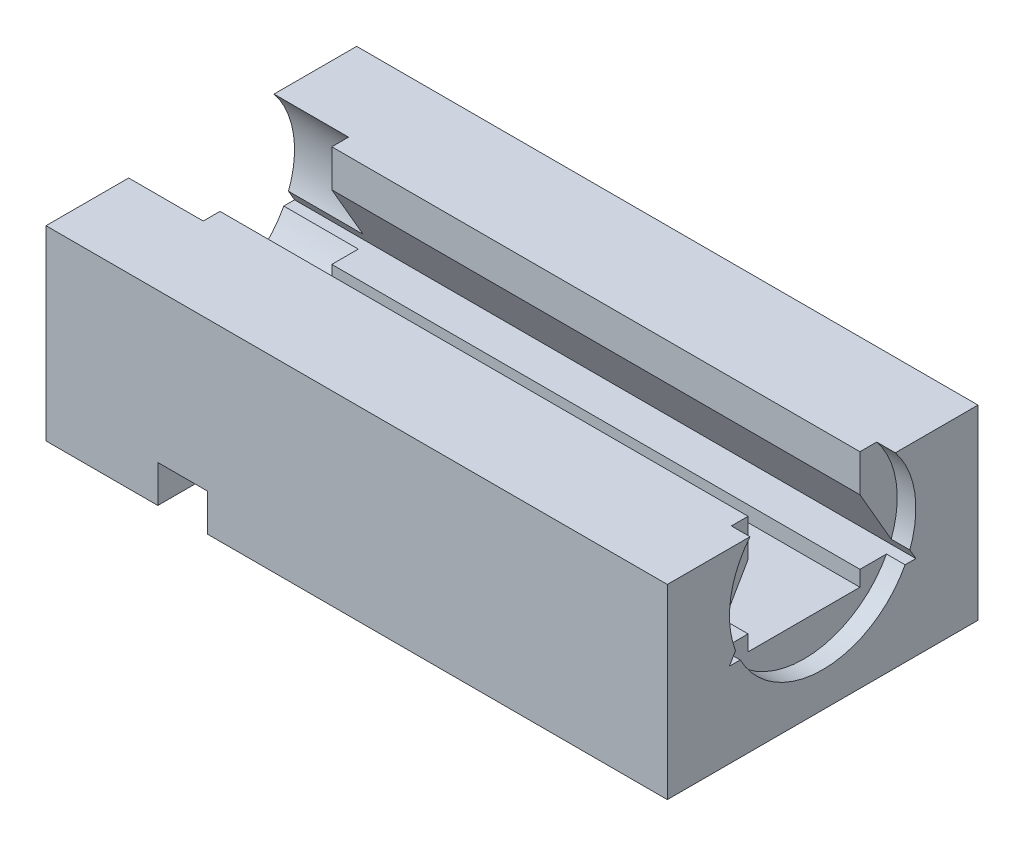
ISO-10303-21;
HEADER;
FILE_DESCRIPTION(('STEP AP214'),'2;1');
FILE_NAME('part.step','',(''),(''),'','','');
FILE_SCHEMA(('AUTOMOTIVE_DESIGN { 1 0 10303 214 1 1 1 1 }'));
ENDSEC;
DATA;
#1=APPLICATION_CONTEXT('core data for automotive mechanical design processes');
#2=APPLICATION_PROTOCOL_DEFINITION('international standard','automotive_design',2000,#1);
#3=PRODUCT_CONTEXT('',#1,'mechanical');
#4=PRODUCT('Part','Part','',(#3));
#5=PRODUCT_RELATED_PRODUCT_CATEGORY('part','',(#4));
#6=PRODUCT_DEFINITION_FORMATION('','',#4);
#7=PRODUCT_DEFINITION_CONTEXT('part definition',#1,'design');
#8=PRODUCT_DEFINITION('design','',#6,#7);
#9=PRODUCT_DEFINITION_SHAPE('','',#8);
#10=(LENGTH_UNIT() NAMED_UNIT(*) SI_UNIT(.MILLI.,.METRE.));
#11=(NAMED_UNIT(*) PLANE_ANGLE_UNIT() SI_UNIT($,.RADIAN.));
#12=(NAMED_UNIT(*) SI_UNIT($,.STERADIAN.) SOLID_ANGLE_UNIT());
#13=UNCERTAINTY_MEASURE_WITH_UNIT(LENGTH_MEASURE(1.E-05),#10,'distance_accuracy_value','');
#14=(GEOMETRIC_REPRESENTATION_CONTEXT(3) GLOBAL_UNCERTAINTY_ASSIGNED_CONTEXT((#13)) GLOBAL_UNIT_ASSIGNED_CONTEXT((#10,
#11,#12)) REPRESENTATION_CONTEXT('',''));
#15=CARTESIAN_POINT('',(0.,0.,0.));
#16=DIRECTION('',(0.,0.,1.));
#17=DIRECTION('',(1.,0.,0.));
#18=AXIS2_PLACEMENT_3D('',#15,#16,#17);
#19=CARTESIAN_POINT('',(0.,1.,0.));
#20=DIRECTION('',(0.,1.,0.));
#21=DIRECTION('',(0.,0.,1.));
#22=AXIS2_PLACEMENT_3D('',#19,#20,#21);
#23=PLANE('',#22);
#24=DIRECTION('',(1.,0.,0.));
#25=VECTOR('',#24,1.);
#26=CARTESIAN_POINT('',(0.,1.,5.));
#27=LINE('',#26,#25);
#28=CARTESIAN_POINT('',(2.6,1.,5.));
#29=VERTEX_POINT('',#28);
#30=CARTESIAN_POINT('',(10.,1.,5.));
#31=VERTEX_POINT('',#30);
#32=EDGE_CURVE('E411',#29,#31,#27,.T.);
#33=ORIENTED_EDGE('',*,*,#32,.F.);
#34=DIRECTION('',(0.,0.,1.));
#35=VECTOR('',#34,1.);
#36=CARTESIAN_POINT('',(2.6,1.,0.));
#37=LINE('',#36,#35);
#38=CARTESIAN_POINT('',(2.6,1.,0.));
#39=VERTEX_POINT('',#38);
#40=EDGE_CURVE('E261',#39,#29,#37,.T.);
#41=ORIENTED_EDGE('',*,*,#40,.F.);
#42=DIRECTION('',(-1.,0.,0.));
#43=VECTOR('',#42,1.);
#44=CARTESIAN_POINT('',(10.,1.,0.));
#45=LINE('',#44,#43);
#46=CARTESIAN_POINT('',(10.,1.,0.));
#47=VERTEX_POINT('',#46);
#48=EDGE_CURVE('E405',#47,#39,#45,.T.);
#49=ORIENTED_EDGE('',*,*,#48,.F.);
#50=DIRECTION('',(0.,0.,-1.));
#51=VECTOR('',#50,1.);
#52=CARTESIAN_POINT('',(10.,1.,5.));
#53=LINE('',#52,#51);
#54=EDGE_CURVE('E415',#31,#47,#53,.T.);
#55=ORIENTED_EDGE('',*,*,#54,.F.);
#56=EDGE_LOOP('',(#33,#41,#49,#55));
#57=FACE_BOUND('',#56,.T.);
#58=ADVANCED_FACE('F35',(#57),#23,.F.);
#59=CARTESIAN_POINT('',(0.,0.,1.6));
#60=DIRECTION('',(0.,0.,-1.));
#61=DIRECTION('',(-1.,0.,0.));
#62=AXIS2_PLACEMENT_3D('',#59,#60,#61);
#63=PLANE('',#62);
#64=DIRECTION('',(0.,-1.,0.));
#65=VECTOR('',#64,1.);
#66=CARTESIAN_POINT('',(9.7,0.,1.6));
#67=LINE('',#66,#65);
#68=CARTESIAN_POINT('',(9.7,2.36076951545868,1.6));
#69=VERTEX_POINT('',#68);
#70=CARTESIAN_POINT('',(9.7,2.11076951545868,1.6));
#71=VERTEX_POINT('',#70);
#72=EDGE_CURVE('E271',#69,#71,#67,.T.);
#73=ORIENTED_EDGE('',*,*,#72,.F.);
#74=DIRECTION('',(1.,0.,0.));
#75=VECTOR('',#74,1.);
#76=CARTESIAN_POINT('',(0.,2.36076951545868,1.6));
#77=LINE('',#76,#75);
#78=CARTESIAN_POINT('',(1.2,2.36076951545868,1.6));
#79=VERTEX_POINT('',#78);
#80=EDGE_CURVE('E366',#79,#69,#77,.T.);
#81=ORIENTED_EDGE('',*,*,#80,.F.);
#82=DIRECTION('',(0.,1.,0.));
#83=VECTOR('',#82,1.);
#84=CARTESIAN_POINT('',(1.2,0.,1.6));
#85=LINE('',#84,#83);
#86=CARTESIAN_POINT('',(1.2,2.11076951545868,1.6));
#87=VERTEX_POINT('',#86);
#88=EDGE_CURVE('E317',#87,#79,#85,.T.);
#89=ORIENTED_EDGE('',*,*,#88,.F.);
#90=DIRECTION('',(1.,0.,0.));
#91=VECTOR('',#90,1.);
#92=CARTESIAN_POINT('',(0.,2.11076951545868,1.6));
#93=LINE('',#92,#91);
#94=EDGE_CURVE('E375',#87,#71,#93,.T.);
#95=ORIENTED_EDGE('',*,*,#94,.T.);
#96=EDGE_LOOP('',(#73,#81,#89,#95));
#97=FACE_BOUND('',#96,.T.);
#98=ADVANCED_FACE('F455',(#97),#63,.F.);
#99=CARTESIAN_POINT('',(0.,2.11076951545868,0.));
#100=DIRECTION('',(0.,-1.,0.));
#101=DIRECTION('',(0.,0.,-1.));
#102=AXIS2_PLACEMENT_3D('',#99,#100,#101);
#103=PLANE('',#102);
#104=DIRECTION('',(0.,0.,1.));
#105=VECTOR('',#104,1.);
#106=CARTESIAN_POINT('',(9.7,2.11076951545868,0.));
#107=LINE('',#106,#105);
#108=CARTESIAN_POINT('',(9.7,2.11076951545868,3.4));
#109=VERTEX_POINT('',#108);
#110=EDGE_CURVE('E273',#71,#109,#107,.T.);
#111=ORIENTED_EDGE('',*,*,#110,.F.);
#112=ORIENTED_EDGE('',*,*,#94,.F.);
#113=DIRECTION('',(0.,0.,-1.));
#114=VECTOR('',#113,1.);
#115=CARTESIAN_POINT('',(1.2,2.11076951545868,0.));
#116=LINE('',#115,#114);
#117=CARTESIAN_POINT('',(1.2,2.11076951545868,3.4));
#118=VERTEX_POINT('',#117);
#119=EDGE_CURVE('E319',#118,#87,#116,.T.);
#120=ORIENTED_EDGE('',*,*,#119,.F.);
#121=DIRECTION('',(1.,0.,0.));
#122=VECTOR('',#121,1.);
#123=CARTESIAN_POINT('',(0.,2.11076951545868,3.4));
#124=LINE('',#123,#122);
#125=EDGE_CURVE('E379',#118,#109,#124,.T.);
#126=ORIENTED_EDGE('',*,*,#125,.T.);
#127=EDGE_LOOP('',(#111,#112,#120,#126));
#128=FACE_BOUND('',#127,.T.);
#129=ADVANCED_FACE('F560',(#128),#103,.F.);
#130=CARTESIAN_POINT('',(0.,0.,3.4));
#131=DIRECTION('',(0.,0.,1.));
#132=DIRECTION('',(1.,0.,0.));
#133=AXIS2_PLACEMENT_3D('',#130,#131,#132);
#134=PLANE('',#133);
#135=DIRECTION('',(0.,1.,0.));
#136=VECTOR('',#135,1.);
#137=CARTESIAN_POINT('',(9.7,0.,3.4));
#138=LINE('',#137,#136);
#139=CARTESIAN_POINT('',(9.7,2.36076951545868,3.4));
#140=VERTEX_POINT('',#139);
#141=EDGE_CURVE('E275',#109,#140,#138,.T.);
#142=ORIENTED_EDGE('',*,*,#141,.F.);
#143=ORIENTED_EDGE('',*,*,#125,.F.);
#144=DIRECTION('',(0.,-1.,0.));
#145=VECTOR('',#144,1.);
#146=CARTESIAN_POINT('',(1.2,0.,3.4));
#147=LINE('',#146,#145);
#148=CARTESIAN_POINT('',(1.2,2.36076951545868,3.4));
#149=VERTEX_POINT('',#148);
#150=EDGE_CURVE('E321',#149,#118,#147,.T.);
#151=ORIENTED_EDGE('',*,*,#150,.F.);
#152=DIRECTION('',(1.,0.,0.));
#153=VECTOR('',#152,1.);
#154=CARTESIAN_POINT('',(0.,2.36076951545868,3.4));
#155=LINE('',#154,#153);
#156=EDGE_CURVE('E382',#149,#140,#155,.T.);
#157=ORIENTED_EDGE('',*,*,#156,.T.);
#158=EDGE_LOOP('',(#142,#143,#151,#157));
#159=FACE_BOUND('',#158,.T.);
#160=ADVANCED_FACE('F693',(#159),#134,.F.);
#161=CARTESIAN_POINT('',(0.,0.,3.4));
#162=DIRECTION('',(0.,0.,-1.));
#163=DIRECTION('',(-1.,0.,0.));
#164=AXIS2_PLACEMENT_3D('',#161,#162,#163);
#165=PLANE('',#164);
#166=DIRECTION('',(1.,0.,0.));
#167=VECTOR('',#166,1.);
#168=CARTESIAN_POINT('',(0.,4.,3.4));
#169=LINE('',#168,#167);
#170=CARTESIAN_POINT('',(1.2,4.,3.4));
#171=VERTEX_POINT('',#170);
#172=CARTESIAN_POINT('',(9.7,4.,3.4));
#173=VERTEX_POINT('',#172);
#174=EDGE_CURVE('E391',#171,#173,#169,.T.);
#175=ORIENTED_EDGE('',*,*,#174,.T.);
#176=DIRECTION('',(0.,-1.,0.));
#177=VECTOR('',#176,1.);
#178=CARTESIAN_POINT('',(9.7,0.,3.4));
#179=LINE('',#178,#177);
#180=CARTESIAN_POINT('',(9.7,3.4,3.4));
#181=VERTEX_POINT('',#180);
#182=EDGE_CURVE('E289',#173,#181,#179,.T.);
#183=ORIENTED_EDGE('',*,*,#182,.T.);
#184=DIRECTION('',(1.,0.,0.));
#185=VECTOR('',#184,1.);
#186=CARTESIAN_POINT('',(0.,3.4,3.4));
#187=LINE('',#186,#185);
#188=CARTESIAN_POINT('',(1.2,3.4,3.4));
#189=VERTEX_POINT('',#188);
#190=EDGE_CURVE('E388',#189,#181,#187,.T.);
#191=ORIENTED_EDGE('',*,*,#190,.F.);
#192=DIRECTION('',(0.,1.,0.));
#193=VECTOR('',#192,1.);
#194=CARTESIAN_POINT('',(1.2,0.,3.4));
#195=LINE('',#194,#193);
#196=EDGE_CURVE('E333',#189,#171,#195,.T.);
#197=ORIENTED_EDGE('',*,*,#196,.T.);
#198=EDGE_LOOP('',(#175,#183,#191,#197));
#199=FACE_BOUND('',#198,.T.);
#200=ADVANCED_FACE('F521',(#199),#165,.T.);
#201=CARTESIAN_POINT('',(0.,0.,1.6));
#202=DIRECTION('',(0.,0.,1.));
#203=DIRECTION('',(1.,0.,0.));
#204=AXIS2_PLACEMENT_3D('',#201,#202,#203);
#205=PLANE('',#204);
#206=DIRECTION('',(1.,0.,0.));
#207=VECTOR('',#206,1.);
#208=CARTESIAN_POINT('',(0.,3.4,1.6));
#209=LINE('',#208,#207);
#210=CARTESIAN_POINT('',(1.2,3.4,1.6));
#211=VERTEX_POINT('',#210);
#212=CARTESIAN_POINT('',(9.7,3.4,1.6));
#213=VERTEX_POINT('',#212);
#214=EDGE_CURVE('E397',#211,#213,#209,.T.);
#215=ORIENTED_EDGE('',*,*,#214,.T.);
#216=DIRECTION('',(0.,1.,0.));
#217=VECTOR('',#216,1.);
#218=CARTESIAN_POINT('',(9.7,0.,1.6));
#219=LINE('',#218,#217);
#220=CARTESIAN_POINT('',(9.7,4.,1.6));
#221=VERTEX_POINT('',#220);
#222=EDGE_CURVE('E281',#213,#221,#219,.T.);
#223=ORIENTED_EDGE('',*,*,#222,.T.);
#224=DIRECTION('',(1.,0.,0.));
#225=VECTOR('',#224,1.);
#226=CARTESIAN_POINT('',(0.,4.,1.6));
#227=LINE('',#226,#225);
#228=CARTESIAN_POINT('',(1.2,4.,1.6));
#229=VERTEX_POINT('',#228);
#230=EDGE_CURVE('E394',#229,#221,#227,.T.);
#231=ORIENTED_EDGE('',*,*,#230,.F.);
#232=DIRECTION('',(0.,-1.,0.));
#233=VECTOR('',#232,1.);
#234=CARTESIAN_POINT('',(1.2,0.,1.6));
#235=LINE('',#234,#233);
#236=EDGE_CURVE('E327',#229,#211,#235,.T.);
#237=ORIENTED_EDGE('',*,*,#236,.T.);
#238=EDGE_LOOP('',(#215,#223,#231,#237));
#239=FACE_BOUND('',#238,.T.);
#240=ADVANCED_FACE('F484',(#239),#205,.T.);
#241=CARTESIAN_POINT('',(10.,1.,5.));
#242=DIRECTION('',(1.,0.,0.));
#243=DIRECTION('',(0.,0.,-1.));
#244=AXIS2_PLACEMENT_3D('',#241,#242,#243);
#245=PLANE('',#244);
#246=CARTESIAN_POINT('',(10.,3.06076951545868,2.5));
#247=DIRECTION('',(1.,0.,0.));
#248=DIRECTION('',(0.,0.,-1.));
#249=AXIS2_PLACEMENT_3D('',#246,#247,#248);
#250=CIRCLE('',#249,1.5);
#251=CARTESIAN_POINT('',(10.,4.,3.66954952734302));
#252=VERTEX_POINT('',#251);
#253=CARTESIAN_POINT('',(10.,2.52930894351317,3.90269371584368));
#254=VERTEX_POINT('',#253);
#255=EDGE_CURVE('E268',#252,#254,#250,.T.);
#256=ORIENTED_EDGE('',*,*,#255,.F.);
#257=DIRECTION('',(0.,0.,-1.));
#258=VECTOR('',#257,1.);
#259=CARTESIAN_POINT('',(10.,4.,5.));
#260=LINE('',#259,#258);
#261=CARTESIAN_POINT('',(10.,4.,5.));
#262=VERTEX_POINT('',#261);
#263=EDGE_CURVE('E429',#262,#252,#260,.T.);
#264=ORIENTED_EDGE('',*,*,#263,.F.);
#265=DIRECTION('',(0.,1.,0.));
#266=VECTOR('',#265,1.);
#267=CARTESIAN_POINT('',(10.,1.,5.));
#268=LINE('',#267,#266);
#269=EDGE_CURVE('E436',#31,#262,#268,.T.);
#270=ORIENTED_EDGE('',*,*,#269,.F.);
#271=ORIENTED_EDGE('',*,*,#54,.T.);
#272=DIRECTION('',(0.,1.,0.));
#273=VECTOR('',#272,1.);
#274=CARTESIAN_POINT('',(10.,1.,0.));
#275=LINE('',#274,#273);
#276=CARTESIAN_POINT('',(10.,4.,0.));
#277=VERTEX_POINT('',#276);
#278=EDGE_CURVE('E432',#47,#277,#275,.T.);
#279=ORIENTED_EDGE('',*,*,#278,.T.);
#280=CARTESIAN_POINT('',(10.,4.,1.33045047265698));
#281=VERTEX_POINT('',#280);
#282=EDGE_CURVE('E428',#281,#277,#260,.T.);
#283=ORIENTED_EDGE('',*,*,#282,.F.);
#284=CARTESIAN_POINT('',(10.,2.52930894351317,1.09730628415632));
#285=VERTEX_POINT('',#284);
#286=EDGE_CURVE('E260',#285,#281,#250,.T.);
#287=ORIENTED_EDGE('',*,*,#286,.F.);
#288=DIRECTION('',(0.,0.866025403784436,0.500000000000004));
#289=VECTOR('',#288,1.);
#290=CARTESIAN_POINT('',(10.,0.157179676972459,-0.27224318643356));
#291=LINE('',#290,#289);
#292=CARTESIAN_POINT('',(10.,2.36076951545868,0.999999999999999));
#293=VERTEX_POINT('',#292);
#294=EDGE_CURVE('E368',#293,#285,#291,.T.);
#295=ORIENTED_EDGE('',*,*,#294,.F.);
#296=DIRECTION('',(0.,0.,-1.));
#297=VECTOR('',#296,1.);
#298=CARTESIAN_POINT('',(10.,2.36076951545868,0.));
#299=LINE('',#298,#297);
#300=CARTESIAN_POINT('',(10.,2.36076951545868,1.17335008385784));
#301=VERTEX_POINT('',#300);
#302=EDGE_CURVE('E354',#301,#293,#299,.T.);
#303=ORIENTED_EDGE('',*,*,#302,.F.);
#304=CARTESIAN_POINT('',(10.,2.36076951545868,3.82664991614216));
#305=VERTEX_POINT('',#304);
#306=EDGE_CURVE('E270',#305,#301,#250,.T.);
#307=ORIENTED_EDGE('',*,*,#306,.F.);
#308=DIRECTION('',(0.,0.,-1.));
#309=VECTOR('',#308,1.);
#310=CARTESIAN_POINT('',(10.,2.36076951545868,0.));
#311=LINE('',#310,#309);
#312=CARTESIAN_POINT('',(10.,2.36076951545868,4.));
#313=VERTEX_POINT('',#312);
#314=EDGE_CURVE('E358',#313,#305,#311,.T.);
#315=ORIENTED_EDGE('',*,*,#314,.F.);
#316=DIRECTION('',(0.,-0.866025403784437,0.500000000000004));
#317=VECTOR('',#316,1.);
#318=CARTESIAN_POINT('',(10.,2.32224318643356,4.02224318643354));
#319=LINE('',#318,#317);
#320=EDGE_CURVE('E371',#254,#313,#319,.T.);
#321=ORIENTED_EDGE('',*,*,#320,.F.);
#322=EDGE_LOOP('',(#256,#264,#270,#271,#279,#283,#287,#295,#303,#307,#315,#321));
#323=FACE_BOUND('',#322,.T.);
#324=ADVANCED_FACE('F509',(#323),#245,.T.);
#325=CARTESIAN_POINT('',(0.,1.,0.));
#326=DIRECTION('',(-1.,0.,0.));
#327=DIRECTION('',(0.,0.,1.));
#328=AXIS2_PLACEMENT_3D('',#325,#326,#327);
#329=PLANE('',#328);
#330=CARTESIAN_POINT('',(0.,3.06076951545868,2.5));
#331=DIRECTION('',(-1.,0.,0.));
#332=DIRECTION('',(0.,0.,1.));
#333=AXIS2_PLACEMENT_3D('',#330,#331,#332);
#334=CIRCLE('',#333,1.5);
#335=CARTESIAN_POINT('',(0.,4.,1.33045047265698));
#336=VERTEX_POINT('',#335);
#337=CARTESIAN_POINT('',(0.,2.52930894351317,1.09730628415632));
#338=VERTEX_POINT('',#337);
#339=EDGE_CURVE('E313',#336,#338,#334,.T.);
#340=ORIENTED_EDGE('',*,*,#339,.F.);
#341=DIRECTION('',(0.,0.,1.));
#342=VECTOR('',#341,1.);
#343=CARTESIAN_POINT('',(0.,4.,0.));
#344=LINE('',#343,#342);
#345=CARTESIAN_POINT('',(0.,4.,0.));
#346=VERTEX_POINT('',#345);
#347=EDGE_CURVE('E422',#346,#336,#344,.T.);
#348=ORIENTED_EDGE('',*,*,#347,.F.);
#349=DIRECTION('',(0.,1.,0.));
#350=VECTOR('',#349,1.);
#351=CARTESIAN_POINT('',(0.,1.,0.));
#352=LINE('',#351,#350);
#353=CARTESIAN_POINT('',(0.,1.,0.));
#354=VERTEX_POINT('',#353);
#355=EDGE_CURVE('E418',#354,#346,#352,.T.);
#356=ORIENTED_EDGE('',*,*,#355,.F.);
#357=DIRECTION('',(0.,0.,1.));
#358=VECTOR('',#357,1.);
#359=CARTESIAN_POINT('',(0.,1.,0.));
#360=LINE('',#359,#358);
#361=CARTESIAN_POINT('',(0.,1.,5.));
#362=VERTEX_POINT('',#361);
#363=EDGE_CURVE('E407',#354,#362,#360,.T.);
#364=ORIENTED_EDGE('',*,*,#363,.T.);
#365=DIRECTION('',(0.,1.,0.));
#366=VECTOR('',#365,1.);
#367=CARTESIAN_POINT('',(0.,1.,5.));
#368=LINE('',#367,#366);
#369=CARTESIAN_POINT('',(0.,4.,5.));
#370=VERTEX_POINT('',#369);
#371=EDGE_CURVE('E438',#362,#370,#368,.T.);
#372=ORIENTED_EDGE('',*,*,#371,.T.);
#373=CARTESIAN_POINT('',(0.,4.,3.66954952734302));
#374=VERTEX_POINT('',#373);
#375=EDGE_CURVE('E421',#374,#370,#344,.T.);
#376=ORIENTED_EDGE('',*,*,#375,.F.);
#377=CARTESIAN_POINT('',(0.,2.52930894351317,3.90269371584368));
#378=VERTEX_POINT('',#377);
#379=EDGE_CURVE('E308',#378,#374,#334,.T.);
#380=ORIENTED_EDGE('',*,*,#379,.F.);
#381=DIRECTION('',(0.,-0.866025403784437,0.500000000000004));
#382=VECTOR('',#381,1.);
#383=CARTESIAN_POINT('',(0.,2.32224318643356,4.02224318643354));
#384=LINE('',#383,#382);
#385=CARTESIAN_POINT('',(0.,2.36076951545868,4.));
#386=VERTEX_POINT('',#385);
#387=EDGE_CURVE('E361',#378,#386,#384,.T.);
#388=ORIENTED_EDGE('',*,*,#387,.T.);
#389=DIRECTION('',(0.,0.,-1.));
#390=VECTOR('',#389,1.);
#391=CARTESIAN_POINT('',(0.,2.36076951545868,0.));
#392=LINE('',#391,#390);
#393=CARTESIAN_POINT('',(0.,2.36076951545868,3.82664991614216));
#394=VERTEX_POINT('',#393);
#395=EDGE_CURVE('E363',#386,#394,#392,.T.);
#396=ORIENTED_EDGE('',*,*,#395,.T.);
#397=CARTESIAN_POINT('',(0.,2.36076951545868,1.17335008385784));
#398=VERTEX_POINT('',#397);
#399=EDGE_CURVE('E316',#398,#394,#334,.T.);
#400=ORIENTED_EDGE('',*,*,#399,.F.);
#401=DIRECTION('',(0.,0.,-1.));
#402=VECTOR('',#401,1.);
#403=CARTESIAN_POINT('',(0.,2.36076951545868,0.));
#404=LINE('',#403,#402);
#405=CARTESIAN_POINT('',(0.,2.36076951545868,0.999999999999999));
#406=VERTEX_POINT('',#405);
#407=EDGE_CURVE('E355',#398,#406,#404,.T.);
#408=ORIENTED_EDGE('',*,*,#407,.T.);
#409=DIRECTION('',(0.,0.866025403784436,0.500000000000004));
#410=VECTOR('',#409,1.);
#411=CARTESIAN_POINT('',(0.,0.157179676972459,-0.27224318643356));
#412=LINE('',#411,#410);
#413=EDGE_CURVE('E357',#406,#338,#412,.T.);
#414=ORIENTED_EDGE('',*,*,#413,.T.);
#415=EDGE_LOOP('',(#340,#348,#356,#364,#372,#376,#380,#388,#396,#400,#408,#414));
#416=FACE_BOUND('',#415,.T.);
#417=ADVANCED_FACE('F491',(#416),#329,.T.);
#418=CARTESIAN_POINT('',(0.,4.,0.));
#419=DIRECTION('',(0.,1.,0.));
#420=DIRECTION('',(0.,0.,1.));
#421=AXIS2_PLACEMENT_3D('',#418,#419,#420);
#422=PLANE('',#421);
#423=DIRECTION('',(1.,0.,0.));
#424=VECTOR('',#423,1.);
#425=CARTESIAN_POINT('',(9.7,4.,3.66954952734302));
#426=LINE('',#425,#424);
#427=CARTESIAN_POINT('',(9.7,4.,3.66954952734302));
#428=VERTEX_POINT('',#427);
#429=EDGE_CURVE('E306',#428,#252,#426,.T.);
#430=ORIENTED_EDGE('',*,*,#429,.F.);
#431=DIRECTION('',(0.,0.,-1.));
#432=VECTOR('',#431,1.);
#433=CARTESIAN_POINT('',(9.7,4.,0.));
#434=LINE('',#433,#432);
#435=EDGE_CURVE('E292',#428,#173,#434,.T.);
#436=ORIENTED_EDGE('',*,*,#435,.T.);
#437=ORIENTED_EDGE('',*,*,#174,.F.);
#438=DIRECTION('',(0.,0.,1.));
#439=VECTOR('',#438,1.);
#440=CARTESIAN_POINT('',(1.2,4.,0.));
#441=LINE('',#440,#439);
#442=CARTESIAN_POINT('',(1.2,4.,3.66954952734302));
#443=VERTEX_POINT('',#442);
#444=EDGE_CURVE('E338',#171,#443,#441,.T.);
#445=ORIENTED_EDGE('',*,*,#444,.T.);
#446=DIRECTION('',(-1.,0.,0.));
#447=VECTOR('',#446,1.);
#448=CARTESIAN_POINT('',(1.2,4.,3.66954952734302));
#449=LINE('',#448,#447);
#450=EDGE_CURVE('E352',#374,#443,#449,.F.);
#451=ORIENTED_EDGE('',*,*,#450,.F.);
#452=ORIENTED_EDGE('',*,*,#375,.T.);
#453=DIRECTION('',(1.,0.,0.));
#454=VECTOR('',#453,1.);
#455=CARTESIAN_POINT('',(0.,4.,5.));
#456=LINE('',#455,#454);
#457=EDGE_CURVE('E425',#370,#262,#456,.T.);
#458=ORIENTED_EDGE('',*,*,#457,.T.);
#459=ORIENTED_EDGE('',*,*,#263,.T.);
#460=EDGE_LOOP('',(#430,#436,#437,#445,#451,#452,#458,#459));
#461=FACE_BOUND('',#460,.T.);
#462=ADVANCED_FACE('F524',(#461),#422,.T.);
#463=DIRECTION('',(1.,0.,0.));
#464=VECTOR('',#463,1.);
#465=CARTESIAN_POINT('',(9.7,4.,1.33045047265698));
#466=LINE('',#465,#464);
#467=CARTESIAN_POINT('',(9.7,4.,1.33045047265698));
#468=VERTEX_POINT('',#467);
#469=EDGE_CURVE('E304',#281,#468,#466,.F.);
#470=ORIENTED_EDGE('',*,*,#469,.F.);
#471=ORIENTED_EDGE('',*,*,#282,.T.);
#472=DIRECTION('',(-1.,0.,0.));
#473=VECTOR('',#472,1.);
#474=CARTESIAN_POINT('',(10.,4.,0.));
#475=LINE('',#474,#473);
#476=EDGE_CURVE('E378',#277,#346,#475,.T.);
#477=ORIENTED_EDGE('',*,*,#476,.T.);
#478=ORIENTED_EDGE('',*,*,#347,.T.);
#479=DIRECTION('',(-1.,0.,0.));
#480=VECTOR('',#479,1.);
#481=CARTESIAN_POINT('',(1.2,4.,1.33045047265698));
#482=LINE('',#481,#480);
#483=CARTESIAN_POINT('',(1.2,4.,1.33045047265698));
#484=VERTEX_POINT('',#483);
#485=EDGE_CURVE('E350',#484,#336,#482,.T.);
#486=ORIENTED_EDGE('',*,*,#485,.F.);
#487=DIRECTION('',(0.,0.,1.));
#488=VECTOR('',#487,1.);
#489=CARTESIAN_POINT('',(1.2,4.,0.));
#490=LINE('',#489,#488);
#491=EDGE_CURVE('E330',#484,#229,#490,.T.);
#492=ORIENTED_EDGE('',*,*,#491,.T.);
#493=ORIENTED_EDGE('',*,*,#230,.T.);
#494=DIRECTION('',(0.,0.,-1.));
#495=VECTOR('',#494,1.);
#496=CARTESIAN_POINT('',(9.7,4.,0.));
#497=LINE('',#496,#495);
#498=EDGE_CURVE('E284',#221,#468,#497,.T.);
#499=ORIENTED_EDGE('',*,*,#498,.T.);
#500=EDGE_LOOP('',(#470,#471,#477,#478,#486,#492,#493,#499));
#501=FACE_BOUND('',#500,.T.);
#502=ADVANCED_FACE('F488',(#501),#422,.T.);
#503=CARTESIAN_POINT('',(10.,1.,0.));
#504=DIRECTION('',(0.,0.,-1.));
#505=DIRECTION('',(-1.,0.,0.));
#506=AXIS2_PLACEMENT_3D('',#503,#504,#505);
#507=PLANE('',#506);
#508=DIRECTION('',(0.,1.,0.));
#509=VECTOR('',#508,1.);
#510=CARTESIAN_POINT('',(2.6,1.6,0.));
#511=LINE('',#510,#509);
#512=CARTESIAN_POINT('',(2.6,1.6,0.));
#513=VERTEX_POINT('',#512);
#514=EDGE_CURVE('E241',#39,#513,#511,.T.);
#515=ORIENTED_EDGE('',*,*,#514,.T.);
#516=DIRECTION('',(-1.,0.,0.));
#517=VECTOR('',#516,1.);
#518=CARTESIAN_POINT('',(1.8,1.6,0.));
#519=LINE('',#518,#517);
#520=CARTESIAN_POINT('',(1.8,1.6,0.));
#521=VERTEX_POINT('',#520);
#522=EDGE_CURVE('E236',#513,#521,#519,.T.);
#523=ORIENTED_EDGE('',*,*,#522,.T.);
#524=DIRECTION('',(0.,-1.,0.));
#525=VECTOR('',#524,1.);
#526=CARTESIAN_POINT('',(1.8,1.,0.));
#527=LINE('',#526,#525);
#528=CARTESIAN_POINT('',(1.8,1.,0.));
#529=VERTEX_POINT('',#528);
#530=EDGE_CURVE('E244',#521,#529,#527,.T.);
#531=ORIENTED_EDGE('',*,*,#530,.T.);
#532=EDGE_CURVE('E408',#529,#354,#45,.T.);
#533=ORIENTED_EDGE('',*,*,#532,.T.);
#534=ORIENTED_EDGE('',*,*,#355,.T.);
#535=ORIENTED_EDGE('',*,*,#476,.F.);
#536=ORIENTED_EDGE('',*,*,#278,.F.);
#537=ORIENTED_EDGE('',*,*,#48,.T.);
#538=EDGE_LOOP('',(#515,#523,#531,#533,#534,#535,#536,#537));
#539=FACE_BOUND('',#538,.T.);
#540=ADVANCED_FACE('F37',(#539),#507,.T.);
#541=CARTESIAN_POINT('',(0.,1.,5.));
#542=DIRECTION('',(0.,0.,1.));
#543=DIRECTION('',(1.,0.,0.));
#544=AXIS2_PLACEMENT_3D('',#541,#542,#543);
#545=PLANE('',#544);
#546=DIRECTION('',(0.,1.,0.));
#547=VECTOR('',#546,1.);
#548=CARTESIAN_POINT('',(2.6,1.6,5.));
#549=LINE('',#548,#547);
#550=CARTESIAN_POINT('',(2.6,1.6,5.));
#551=VERTEX_POINT('',#550);
#552=EDGE_CURVE('E250',#29,#551,#549,.T.);
#553=ORIENTED_EDGE('',*,*,#552,.F.);
#554=ORIENTED_EDGE('',*,*,#32,.T.);
#555=ORIENTED_EDGE('',*,*,#269,.T.);
#556=ORIENTED_EDGE('',*,*,#457,.F.);
#557=ORIENTED_EDGE('',*,*,#371,.F.);
#558=CARTESIAN_POINT('',(1.8,1.,5.));
#559=VERTEX_POINT('',#558);
#560=EDGE_CURVE('E412',#362,#559,#27,.T.);
#561=ORIENTED_EDGE('',*,*,#560,.T.);
#562=DIRECTION('',(0.,-1.,0.));
#563=VECTOR('',#562,1.);
#564=CARTESIAN_POINT('',(1.8,1.,5.));
#565=LINE('',#564,#563);
#566=CARTESIAN_POINT('',(1.8,1.6,5.));
#567=VERTEX_POINT('',#566);
#568=EDGE_CURVE('E50',#567,#559,#565,.T.);
#569=ORIENTED_EDGE('',*,*,#568,.F.);
#570=DIRECTION('',(-1.,0.,0.));
#571=VECTOR('',#570,1.);
#572=CARTESIAN_POINT('',(1.8,1.6,5.));
#573=LINE('',#572,#571);
#574=EDGE_CURVE('E239',#551,#567,#573,.T.);
#575=ORIENTED_EDGE('',*,*,#574,.F.);
#576=EDGE_LOOP('',(#553,#554,#555,#556,#557,#561,#569,#575));
#577=FACE_BOUND('',#576,.T.);
#578=ADVANCED_FACE('F564',(#577),#545,.T.);
#579=ORIENTED_EDGE('',*,*,#532,.F.);
#580=DIRECTION('',(0.,0.,1.));
#581=VECTOR('',#580,1.);
#582=CARTESIAN_POINT('',(1.8,1.,0.));
#583=LINE('',#582,#581);
#584=EDGE_CURVE('E240',#529,#559,#583,.T.);
#585=ORIENTED_EDGE('',*,*,#584,.T.);
#586=ORIENTED_EDGE('',*,*,#560,.F.);
#587=ORIENTED_EDGE('',*,*,#363,.F.);
#588=EDGE_LOOP('',(#579,#585,#586,#587));
#589=FACE_BOUND('',#588,.T.);
#590=ADVANCED_FACE('F556',(#589),#23,.F.);
#591=CARTESIAN_POINT('',(0.,2.36076951545868,0.));
#592=DIRECTION('',(0.,-1.,0.));
#593=DIRECTION('',(0.,0.,-1.));
#594=AXIS2_PLACEMENT_3D('',#591,#592,#593);
#595=PLANE('',#594);
#596=ORIENTED_EDGE('',*,*,#314,.T.);
#597=DIRECTION('',(1.,0.,0.));
#598=VECTOR('',#597,1.);
#599=CARTESIAN_POINT('',(9.7,2.36076951545868,3.82664991614216));
#600=LINE('',#599,#598);
#601=CARTESIAN_POINT('',(9.7,2.36076951545868,3.82664991614216));
#602=VERTEX_POINT('',#601);
#603=EDGE_CURVE('E301',#305,#602,#600,.F.);
#604=ORIENTED_EDGE('',*,*,#603,.T.);
#605=DIRECTION('',(0.,0.,1.));
#606=VECTOR('',#605,1.);
#607=CARTESIAN_POINT('',(9.7,2.36076951545868,0.));
#608=LINE('',#607,#606);
#609=EDGE_CURVE('E277',#140,#602,#608,.T.);
#610=ORIENTED_EDGE('',*,*,#609,.F.);
#611=ORIENTED_EDGE('',*,*,#156,.F.);
#612=DIRECTION('',(0.,0.,-1.));
#613=VECTOR('',#612,1.);
#614=CARTESIAN_POINT('',(1.2,2.36076951545868,0.));
#615=LINE('',#614,#613);
#616=CARTESIAN_POINT('',(1.2,2.36076951545868,3.82664991614216));
#617=VERTEX_POINT('',#616);
#618=EDGE_CURVE('E323',#617,#149,#615,.T.);
#619=ORIENTED_EDGE('',*,*,#618,.F.);
#620=DIRECTION('',(-1.,0.,0.));
#621=VECTOR('',#620,1.);
#622=CARTESIAN_POINT('',(1.2,2.36076951545868,3.82664991614216));
#623=LINE('',#622,#621);
#624=EDGE_CURVE('E347',#617,#394,#623,.T.);
#625=ORIENTED_EDGE('',*,*,#624,.T.);
#626=ORIENTED_EDGE('',*,*,#395,.F.);
#627=DIRECTION('',(1.,0.,0.));
#628=VECTOR('',#627,1.);
#629=CARTESIAN_POINT('',(0.,2.36076951545868,4.));
#630=LINE('',#629,#628);
#631=EDGE_CURVE('E385',#386,#313,#630,.T.);
#632=ORIENTED_EDGE('',*,*,#631,.T.);
#633=EDGE_LOOP('',(#596,#604,#610,#611,#619,#625,#626,#632));
#634=FACE_BOUND('',#633,.T.);
#635=ADVANCED_FACE('F495',(#634),#595,.F.);
#636=CARTESIAN_POINT('',(0.,2.32224318643356,4.02224318643354));
#637=DIRECTION('',(0.,0.500000000000004,0.866025403784437));
#638=DIRECTION('',(0.,-0.866025403784437,0.500000000000004));
#639=AXIS2_PLACEMENT_3D('',#636,#637,#638);
#640=PLANE('',#639);
#641=DIRECTION('',(0.,0.866025403784437,-0.500000000000004));
#642=VECTOR('',#641,1.);
#643=CARTESIAN_POINT('',(9.7,2.32224318643356,4.02224318643354));
#644=LINE('',#643,#642);
#645=CARTESIAN_POINT('',(9.7,2.52930894351317,3.90269371584368));
#646=VERTEX_POINT('',#645);
#647=EDGE_CURVE('E287',#646,#181,#644,.T.);
#648=ORIENTED_EDGE('',*,*,#647,.F.);
#649=DIRECTION('',(1.,0.,0.));
#650=VECTOR('',#649,1.);
#651=CARTESIAN_POINT('',(9.7,2.52930894351317,3.90269371584368));
#652=LINE('',#651,#650);
#653=EDGE_CURVE('E298',#646,#254,#652,.T.);
#654=ORIENTED_EDGE('',*,*,#653,.T.);
#655=ORIENTED_EDGE('',*,*,#320,.T.);
#656=ORIENTED_EDGE('',*,*,#631,.F.);
#657=ORIENTED_EDGE('',*,*,#387,.F.);
#658=DIRECTION('',(-1.,0.,0.));
#659=VECTOR('',#658,1.);
#660=CARTESIAN_POINT('',(1.2,2.52930894351317,3.90269371584368));
#661=LINE('',#660,#659);
#662=CARTESIAN_POINT('',(1.2,2.52930894351317,3.90269371584368));
#663=VERTEX_POINT('',#662);
#664=EDGE_CURVE('E344',#378,#663,#661,.F.);
#665=ORIENTED_EDGE('',*,*,#664,.T.);
#666=DIRECTION('',(0.,-0.866025403784437,0.500000000000004));
#667=VECTOR('',#666,1.);
#668=CARTESIAN_POINT('',(1.2,2.32224318643356,4.02224318643354));
#669=LINE('',#668,#667);
#670=EDGE_CURVE('E336',#189,#663,#669,.T.);
#671=ORIENTED_EDGE('',*,*,#670,.F.);
#672=ORIENTED_EDGE('',*,*,#190,.T.);
#673=EDGE_LOOP('',(#648,#654,#655,#656,#657,#665,#671,#672));
#674=FACE_BOUND('',#673,.T.);
#675=ADVANCED_FACE('F503',(#674),#640,.F.);
#676=CARTESIAN_POINT('',(0.,0.157179676972459,-0.27224318643356));
#677=DIRECTION('',(0.,0.500000000000004,-0.866025403784436));
#678=DIRECTION('',(0.,0.866025403784436,0.500000000000004));
#679=AXIS2_PLACEMENT_3D('',#676,#677,#678);
#680=PLANE('',#679);
#681=ORIENTED_EDGE('',*,*,#294,.T.);
#682=DIRECTION('',(1.,0.,0.));
#683=VECTOR('',#682,1.);
#684=CARTESIAN_POINT('',(9.7,2.52930894351317,1.09730628415632));
#685=LINE('',#684,#683);
#686=CARTESIAN_POINT('',(9.7,2.52930894351317,1.09730628415632));
#687=VERTEX_POINT('',#686);
#688=EDGE_CURVE('E295',#285,#687,#685,.F.);
#689=ORIENTED_EDGE('',*,*,#688,.T.);
#690=DIRECTION('',(0.,-0.866025403784436,-0.500000000000004));
#691=VECTOR('',#690,1.);
#692=CARTESIAN_POINT('',(9.7,0.157179676972459,-0.27224318643356));
#693=LINE('',#692,#691);
#694=EDGE_CURVE('E279',#213,#687,#693,.T.);
#695=ORIENTED_EDGE('',*,*,#694,.F.);
#696=ORIENTED_EDGE('',*,*,#214,.F.);
#697=DIRECTION('',(0.,0.866025403784436,0.500000000000004));
#698=VECTOR('',#697,1.);
#699=CARTESIAN_POINT('',(1.2,0.157179676972459,-0.27224318643356));
#700=LINE('',#699,#698);
#701=CARTESIAN_POINT('',(1.2,2.52930894351317,1.09730628415632));
#702=VERTEX_POINT('',#701);
#703=EDGE_CURVE('E325',#702,#211,#700,.T.);
#704=ORIENTED_EDGE('',*,*,#703,.F.);
#705=DIRECTION('',(-1.,0.,0.));
#706=VECTOR('',#705,1.);
#707=CARTESIAN_POINT('',(1.2,2.52930894351317,1.09730628415632));
#708=LINE('',#707,#706);
#709=EDGE_CURVE('E341',#702,#338,#708,.T.);
#710=ORIENTED_EDGE('',*,*,#709,.T.);
#711=ORIENTED_EDGE('',*,*,#413,.F.);
#712=DIRECTION('',(1.,0.,0.));
#713=VECTOR('',#712,1.);
#714=CARTESIAN_POINT('',(0.,2.36076951545868,0.999999999999999));
#715=LINE('',#714,#713);
#716=EDGE_CURVE('E400',#406,#293,#715,.T.);
#717=ORIENTED_EDGE('',*,*,#716,.T.);
#718=EDGE_LOOP('',(#681,#689,#695,#696,#704,#710,#711,#717));
#719=FACE_BOUND('',#718,.T.);
#720=ADVANCED_FACE('F481',(#719),#680,.F.);
#721=CARTESIAN_POINT('',(0.,2.36076951545868,0.));
#722=DIRECTION('',(0.,-1.,0.));
#723=DIRECTION('',(0.,0.,-1.));
#724=AXIS2_PLACEMENT_3D('',#721,#722,#723);
#725=PLANE('',#724);
#726=DIRECTION('',(0.,0.,1.));
#727=VECTOR('',#726,1.);
#728=CARTESIAN_POINT('',(9.7,2.36076951545868,0.));
#729=LINE('',#728,#727);
#730=CARTESIAN_POINT('',(9.7,2.36076951545868,1.17335008385784));
#731=VERTEX_POINT('',#730);
#732=EDGE_CURVE('E43',#731,#69,#729,.T.);
#733=ORIENTED_EDGE('',*,*,#732,.F.);
#734=DIRECTION('',(1.,0.,0.));
#735=VECTOR('',#734,1.);
#736=CARTESIAN_POINT('',(9.7,2.36076951545868,1.17335008385784));
#737=LINE('',#736,#735);
#738=EDGE_CURVE('E11',#731,#301,#737,.T.);
#739=ORIENTED_EDGE('',*,*,#738,.T.);
#740=ORIENTED_EDGE('',*,*,#302,.T.);
#741=ORIENTED_EDGE('',*,*,#716,.F.);
#742=ORIENTED_EDGE('',*,*,#407,.F.);
#743=DIRECTION('',(-1.,0.,0.));
#744=VECTOR('',#743,1.);
#745=CARTESIAN_POINT('',(1.2,2.36076951545868,1.17335008385784));
#746=LINE('',#745,#744);
#747=CARTESIAN_POINT('',(1.2,2.36076951545868,1.17335008385784));
#748=VERTEX_POINT('',#747);
#749=EDGE_CURVE('E443',#398,#748,#746,.F.);
#750=ORIENTED_EDGE('',*,*,#749,.T.);
#751=DIRECTION('',(0.,0.,-1.));
#752=VECTOR('',#751,1.);
#753=CARTESIAN_POINT('',(1.2,2.36076951545868,0.));
#754=LINE('',#753,#752);
#755=EDGE_CURVE('E435',#79,#748,#754,.T.);
#756=ORIENTED_EDGE('',*,*,#755,.F.);
#757=ORIENTED_EDGE('',*,*,#80,.T.);
#758=EDGE_LOOP('',(#733,#739,#740,#741,#742,#750,#756,#757));
#759=FACE_BOUND('',#758,.T.);
#760=ADVANCED_FACE('F459',(#759),#725,.F.);
#761=CARTESIAN_POINT('',(1.2,3.06076951545868,2.5));
#762=DIRECTION('',(-1.,0.,0.));
#763=DIRECTION('',(0.,0.,1.));
#764=AXIS2_PLACEMENT_3D('',#761,#762,#763);
#765=PLANE('',#764);
#766=ORIENTED_EDGE('',*,*,#618,.T.);
#767=ORIENTED_EDGE('',*,*,#150,.T.);
#768=ORIENTED_EDGE('',*,*,#119,.T.);
#769=ORIENTED_EDGE('',*,*,#88,.T.);
#770=ORIENTED_EDGE('',*,*,#755,.T.);
#771=CARTESIAN_POINT('',(1.2,3.06076951545868,2.5));
#772=DIRECTION('',(-1.,0.,0.));
#773=DIRECTION('',(0.,0.,1.));
#774=AXIS2_PLACEMENT_3D('',#771,#772,#773);
#775=CIRCLE('',#774,1.5);
#776=EDGE_CURVE('E312',#748,#617,#775,.T.);
#777=ORIENTED_EDGE('',*,*,#776,.T.);
#778=EDGE_LOOP('',(#766,#767,#768,#769,#770,#777));
#779=FACE_BOUND('',#778,.T.);
#780=ADVANCED_FACE('F464',(#779),#765,.T.);
#781=CARTESIAN_POINT('',(1.2,3.06076951545868,2.5));
#782=DIRECTION('',(-1.,0.,0.));
#783=DIRECTION('',(0.,0.,1.));
#784=AXIS2_PLACEMENT_3D('',#781,#782,#783);
#785=CYLINDRICAL_SURFACE('',#784,1.5);
#786=ORIENTED_EDGE('',*,*,#776,.F.);
#787=ORIENTED_EDGE('',*,*,#749,.F.);
#788=ORIENTED_EDGE('',*,*,#399,.T.);
#789=ORIENTED_EDGE('',*,*,#624,.F.);
#790=EDGE_LOOP('',(#786,#787,#788,#789));
#791=FACE_BOUND('',#790,.T.);
#792=ADVANCED_FACE('F467',(#791),#785,.F.);
#793=EDGE_CURVE('E314',#484,#702,#775,.T.);
#794=ORIENTED_EDGE('',*,*,#793,.T.);
#795=ORIENTED_EDGE('',*,*,#703,.T.);
#796=ORIENTED_EDGE('',*,*,#236,.F.);
#797=ORIENTED_EDGE('',*,*,#491,.F.);
#798=EDGE_LOOP('',(#794,#795,#796,#797));
#799=FACE_BOUND('',#798,.T.);
#800=ADVANCED_FACE('F472',(#799),#765,.T.);
#801=ORIENTED_EDGE('',*,*,#485,.T.);
#802=ORIENTED_EDGE('',*,*,#339,.T.);
#803=ORIENTED_EDGE('',*,*,#709,.F.);
#804=ORIENTED_EDGE('',*,*,#793,.F.);
#805=EDGE_LOOP('',(#801,#802,#803,#804));
#806=FACE_BOUND('',#805,.T.);
#807=ADVANCED_FACE('F476',(#806),#785,.F.);
#808=ORIENTED_EDGE('',*,*,#450,.T.);
#809=EDGE_CURVE('E309',#663,#443,#775,.T.);
#810=ORIENTED_EDGE('',*,*,#809,.F.);
#811=ORIENTED_EDGE('',*,*,#664,.F.);
#812=ORIENTED_EDGE('',*,*,#379,.T.);
#813=EDGE_LOOP('',(#808,#810,#811,#812));
#814=FACE_BOUND('',#813,.T.);
#815=ADVANCED_FACE('F723',(#814),#785,.F.);
#816=ORIENTED_EDGE('',*,*,#196,.F.);
#817=ORIENTED_EDGE('',*,*,#670,.T.);
#818=ORIENTED_EDGE('',*,*,#809,.T.);
#819=ORIENTED_EDGE('',*,*,#444,.F.);
#820=EDGE_LOOP('',(#816,#817,#818,#819));
#821=FACE_BOUND('',#820,.T.);
#822=ADVANCED_FACE('F553',(#821),#765,.T.);
#823=CARTESIAN_POINT('',(9.7,3.06076951545868,2.5));
#824=DIRECTION('',(1.,0.,0.));
#825=DIRECTION('',(0.,0.,-1.));
#826=AXIS2_PLACEMENT_3D('',#823,#824,#825);
#827=PLANE('',#826);
#828=ORIENTED_EDGE('',*,*,#609,.T.);
#829=CARTESIAN_POINT('',(9.7,3.06076951545868,2.5));
#830=DIRECTION('',(1.,0.,0.));
#831=DIRECTION('',(0.,0.,-1.));
#832=AXIS2_PLACEMENT_3D('',#829,#830,#831);
#833=CIRCLE('',#832,1.5);
#834=EDGE_CURVE('E267',#602,#731,#833,.T.);
#835=ORIENTED_EDGE('',*,*,#834,.T.);
#836=ORIENTED_EDGE('',*,*,#732,.T.);
#837=ORIENTED_EDGE('',*,*,#72,.T.);
#838=ORIENTED_EDGE('',*,*,#110,.T.);
#839=ORIENTED_EDGE('',*,*,#141,.T.);
#840=EDGE_LOOP('',(#828,#835,#836,#837,#838,#839));
#841=FACE_BOUND('',#840,.T.);
#842=ADVANCED_FACE('F448',(#841),#827,.T.);
#843=CARTESIAN_POINT('',(9.7,3.06076951545868,2.5));
#844=DIRECTION('',(1.,0.,0.));
#845=DIRECTION('',(0.,0.,-1.));
#846=AXIS2_PLACEMENT_3D('',#843,#844,#845);
#847=CYLINDRICAL_SURFACE('',#846,1.5);
#848=ORIENTED_EDGE('',*,*,#306,.T.);
#849=ORIENTED_EDGE('',*,*,#738,.F.);
#850=ORIENTED_EDGE('',*,*,#834,.F.);
#851=ORIENTED_EDGE('',*,*,#603,.F.);
#852=EDGE_LOOP('',(#848,#849,#850,#851));
#853=FACE_BOUND('',#852,.T.);
#854=ADVANCED_FACE('F543',(#853),#847,.F.);
#855=ORIENTED_EDGE('',*,*,#222,.F.);
#856=ORIENTED_EDGE('',*,*,#694,.T.);
#857=EDGE_CURVE('E264',#687,#468,#833,.T.);
#858=ORIENTED_EDGE('',*,*,#857,.T.);
#859=ORIENTED_EDGE('',*,*,#498,.F.);
#860=EDGE_LOOP('',(#855,#856,#858,#859));
#861=FACE_BOUND('',#860,.T.);
#862=ADVANCED_FACE('F541',(#861),#827,.T.);
#863=ORIENTED_EDGE('',*,*,#469,.T.);
#864=ORIENTED_EDGE('',*,*,#857,.F.);
#865=ORIENTED_EDGE('',*,*,#688,.F.);
#866=ORIENTED_EDGE('',*,*,#286,.T.);
#867=EDGE_LOOP('',(#863,#864,#865,#866));
#868=FACE_BOUND('',#867,.T.);
#869=ADVANCED_FACE('F539',(#868),#847,.F.);
#870=ORIENTED_EDGE('',*,*,#429,.T.);
#871=ORIENTED_EDGE('',*,*,#255,.T.);
#872=ORIENTED_EDGE('',*,*,#653,.F.);
#873=EDGE_CURVE('E58',#428,#646,#833,.T.);
#874=ORIENTED_EDGE('',*,*,#873,.F.);
#875=EDGE_LOOP('',(#870,#871,#872,#874));
#876=FACE_BOUND('',#875,.T.);
#877=ADVANCED_FACE('F514',(#876),#847,.F.);
#878=ORIENTED_EDGE('',*,*,#873,.T.);
#879=ORIENTED_EDGE('',*,*,#647,.T.);
#880=ORIENTED_EDGE('',*,*,#182,.F.);
#881=ORIENTED_EDGE('',*,*,#435,.F.);
#882=EDGE_LOOP('',(#878,#879,#880,#881));
#883=FACE_BOUND('',#882,.T.);
#884=ADVANCED_FACE('F519',(#883),#827,.T.);
#885=CARTESIAN_POINT('',(1.8,1.6,0.));
#886=DIRECTION('',(0.,1.,0.));
#887=DIRECTION('',(0.,0.,1.));
#888=AXIS2_PLACEMENT_3D('',#885,#886,#887);
#889=PLANE('',#888);
#890=ORIENTED_EDGE('',*,*,#574,.T.);
#891=DIRECTION('',(0.,0.,1.));
#892=VECTOR('',#891,1.);
#893=CARTESIAN_POINT('',(1.8,1.6,0.));
#894=LINE('',#893,#892);
#895=EDGE_CURVE('E232',#521,#567,#894,.T.);
#896=ORIENTED_EDGE('',*,*,#895,.F.);
#897=ORIENTED_EDGE('',*,*,#522,.F.);
#898=DIRECTION('',(0.,0.,1.));
#899=VECTOR('',#898,1.);
#900=CARTESIAN_POINT('',(2.6,1.6,0.));
#901=LINE('',#900,#899);
#902=EDGE_CURVE('E258',#513,#551,#901,.T.);
#903=ORIENTED_EDGE('',*,*,#902,.T.);
#904=EDGE_LOOP('',(#890,#896,#897,#903));
#905=FACE_BOUND('',#904,.T.);
#906=ADVANCED_FACE('F234',(#905),#889,.F.);
#907=CARTESIAN_POINT('',(2.6,1.6,0.));
#908=DIRECTION('',(1.,0.,0.));
#909=DIRECTION('',(0.,0.,-1.));
#910=AXIS2_PLACEMENT_3D('',#907,#908,#909);
#911=PLANE('',#910);
#912=ORIENTED_EDGE('',*,*,#552,.T.);
#913=ORIENTED_EDGE('',*,*,#902,.F.);
#914=ORIENTED_EDGE('',*,*,#514,.F.);
#915=ORIENTED_EDGE('',*,*,#40,.T.);
#916=EDGE_LOOP('',(#912,#913,#914,#915));
#917=FACE_BOUND('',#916,.T.);
#918=ADVANCED_FACE('F576',(#917),#911,.F.);
#919=CARTESIAN_POINT('',(1.8,1.,0.));
#920=DIRECTION('',(-1.,0.,0.));
#921=DIRECTION('',(0.,0.,1.));
#922=AXIS2_PLACEMENT_3D('',#919,#920,#921);
#923=PLANE('',#922);
#924=ORIENTED_EDGE('',*,*,#568,.T.);
#925=ORIENTED_EDGE('',*,*,#584,.F.);
#926=ORIENTED_EDGE('',*,*,#530,.F.);
#927=ORIENTED_EDGE('',*,*,#895,.T.);
#928=EDGE_LOOP('',(#924,#925,#926,#927));
#929=FACE_BOUND('',#928,.T.);
#930=ADVANCED_FACE('F245',(#929),#923,.F.);
#931=CLOSED_SHELL('',(#58,#98,#129,#160,#200,#240,#324,#417,#462,#502,#540,#578,#590,#635,#675,
#720,#760,#780,#792,#800,#807,#815,#822,#842,#854,#862,#869,#877,#884,#906,#918,#930));
#932=MANIFOLD_SOLID_BREP('B2',#931);
#933=ADVANCED_BREP_SHAPE_REPRESENTATION('',(#18,#932),#14);
#934=SHAPE_DEFINITION_REPRESENTATION(#9,#933);
ENDSEC;
END-ISO-10303-21;
